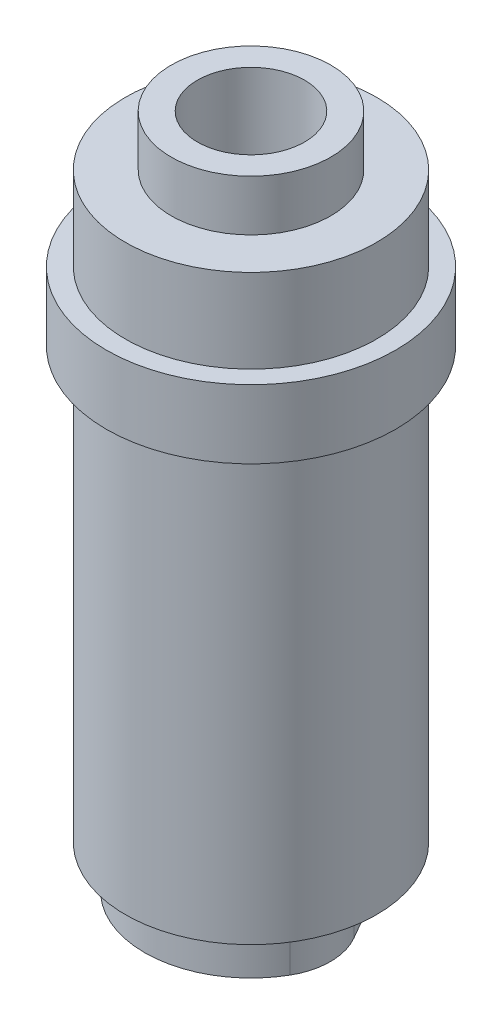
ISO-10303-21;
HEADER;
FILE_DESCRIPTION(('STEP AP214'),'2;1');
FILE_NAME('part.step','',(''),(''),'','','');
FILE_SCHEMA(('AUTOMOTIVE_DESIGN { 1 0 10303 214 1 1 1 1 }'));
ENDSEC;
DATA;
#1=APPLICATION_CONTEXT('core data for automotive mechanical design processes');
#2=APPLICATION_PROTOCOL_DEFINITION('international standard','automotive_design',2000,#1);
#3=PRODUCT_CONTEXT('',#1,'mechanical');
#4=PRODUCT('Part','Part','',(#3));
#5=PRODUCT_RELATED_PRODUCT_CATEGORY('part','',(#4));
#6=PRODUCT_DEFINITION_FORMATION('','',#4);
#7=PRODUCT_DEFINITION_CONTEXT('part definition',#1,'design');
#8=PRODUCT_DEFINITION('design','',#6,#7);
#9=PRODUCT_DEFINITION_SHAPE('','',#8);
#10=(LENGTH_UNIT() NAMED_UNIT(*) SI_UNIT(.MILLI.,.METRE.));
#11=(NAMED_UNIT(*) PLANE_ANGLE_UNIT() SI_UNIT($,.RADIAN.));
#12=(NAMED_UNIT(*) SI_UNIT($,.STERADIAN.) SOLID_ANGLE_UNIT());
#13=UNCERTAINTY_MEASURE_WITH_UNIT(LENGTH_MEASURE(1.E-05),#10,'distance_accuracy_value','');
#14=(GEOMETRIC_REPRESENTATION_CONTEXT(3) GLOBAL_UNCERTAINTY_ASSIGNED_CONTEXT((#13)) GLOBAL_UNIT_ASSIGNED_CONTEXT((#10,
#11,#12)) REPRESENTATION_CONTEXT('',''));
#15=CARTESIAN_POINT('',(0.,0.,0.));
#16=DIRECTION('',(0.,0.,1.));
#17=DIRECTION('',(1.,0.,0.));
#18=AXIS2_PLACEMENT_3D('',#15,#16,#17);
#19=CARTESIAN_POINT('',(0.,19.05,0.));
#20=DIRECTION('',(0.,-1.,0.));
#21=DIRECTION('',(0.,0.,-1.));
#22=AXIS2_PLACEMENT_3D('',#19,#20,#21);
#23=CYLINDRICAL_SURFACE('',#22,4.7625);
#24=CARTESIAN_POINT('',(0.,37.285900282,0.));
#25=DIRECTION('',(0.,-1.,0.));
#26=DIRECTION('',(0.,0.,-1.));
#27=AXIS2_PLACEMENT_3D('',#24,#25,#26);
#28=CIRCLE('',#27,4.7625);
#29=CARTESIAN_POINT('',(0.,37.285900282,-4.7625));
#30=VERTEX_POINT('',#29);
#31=EDGE_CURVE('E117',#30,#30,#28,.T.);
#32=ORIENTED_EDGE('',*,*,#31,.F.);
#33=EDGE_LOOP('',(#32));
#34=FACE_BOUND('',#33,.T.);
#35=CARTESIAN_POINT('',(0.,40.321700408,0.));
#36=DIRECTION('',(0.,-1.,0.));
#37=DIRECTION('',(0.,0.,-1.));
#38=AXIS2_PLACEMENT_3D('',#35,#36,#37);
#39=CIRCLE('',#38,4.7625);
#40=CARTESIAN_POINT('',(0.,40.321700408,-4.7625));
#41=VERTEX_POINT('',#40);
#42=EDGE_CURVE('E12',#41,#41,#39,.T.);
#43=ORIENTED_EDGE('',*,*,#42,.T.);
#44=EDGE_LOOP('',(#43));
#45=FACE_BOUND('',#44,.T.);
#46=ADVANCED_FACE('F20',(#34,#45),#23,.T.);
#47=CARTESIAN_POINT('',(-4.7625,40.321700408,0.));
#48=DIRECTION('',(0.,-1.,0.));
#49=DIRECTION('',(0.,0.,-1.));
#50=AXIS2_PLACEMENT_3D('',#47,#48,#49);
#51=PLANE('',#50);
#52=ORIENTED_EDGE('',*,*,#42,.F.);
#53=EDGE_LOOP('',(#52));
#54=FACE_BOUND('',#53,.T.);
#55=CARTESIAN_POINT('',(0.,40.321700408,0.));
#56=DIRECTION('',(0.,-1.,0.));
#57=DIRECTION('',(0.,0.,-1.));
#58=AXIS2_PLACEMENT_3D('',#55,#56,#57);
#59=CIRCLE('',#58,3.2004);
#60=CARTESIAN_POINT('',(0.,40.321700408,-3.2004));
#61=VERTEX_POINT('',#60);
#62=EDGE_CURVE('E31',#61,#61,#59,.T.);
#63=ORIENTED_EDGE('',*,*,#62,.T.);
#64=EDGE_LOOP('',(#63));
#65=FACE_BOUND('',#64,.T.);
#66=ADVANCED_FACE('F347',(#54,#65),#51,.F.);
#67=CARTESIAN_POINT('',(0.,19.05,0.));
#68=DIRECTION('',(0.,-1.,0.));
#69=DIRECTION('',(0.,0.,-1.));
#70=AXIS2_PLACEMENT_3D('',#67,#68,#69);
#71=CYLINDRICAL_SURFACE('',#70,3.2004);
#72=ORIENTED_EDGE('',*,*,#62,.F.);
#73=EDGE_LOOP('',(#72));
#74=FACE_BOUND('',#73,.T.);
#75=CARTESIAN_POINT('',(0.,27.621700408,0.));
#76=DIRECTION('',(0.,-1.,0.));
#77=DIRECTION('',(0.,0.,-1.));
#78=AXIS2_PLACEMENT_3D('',#75,#76,#77);
#79=CIRCLE('',#78,3.2004);
#80=CARTESIAN_POINT('',(0.,27.621700408,-3.2004));
#81=VERTEX_POINT('',#80);
#82=EDGE_CURVE('E263',#81,#81,#79,.T.);
#83=ORIENTED_EDGE('',*,*,#82,.T.);
#84=EDGE_LOOP('',(#83));
#85=FACE_BOUND('',#84,.T.);
#86=ADVANCED_FACE('F352',(#74,#85),#71,.F.);
#87=CARTESIAN_POINT('',(-3.2004,27.621700408,0.));
#88=DIRECTION('',(0.,-1.,0.));
#89=DIRECTION('',(0.,0.,-1.));
#90=AXIS2_PLACEMENT_3D('',#87,#88,#89);
#91=PLANE('',#90);
#92=CARTESIAN_POINT('',(0.,27.621700408,0.));
#93=DIRECTION('',(0.,-1.,0.));
#94=DIRECTION('',(0.,0.,-1.));
#95=AXIS2_PLACEMENT_3D('',#92,#93,#94);
#96=CIRCLE('',#95,2.5527);
#97=CARTESIAN_POINT('',(0.,27.621700408,-2.5527));
#98=VERTEX_POINT('',#97);
#99=EDGE_CURVE('E147',#98,#98,#96,.T.);
#100=ORIENTED_EDGE('',*,*,#99,.T.);
#101=EDGE_LOOP('',(#100));
#102=FACE_BOUND('',#101,.T.);
#103=ORIENTED_EDGE('',*,*,#82,.F.);
#104=EDGE_LOOP('',(#103));
#105=FACE_BOUND('',#104,.T.);
#106=ADVANCED_FACE('F330',(#102,#105),#91,.F.);
#107=CARTESIAN_POINT('',(-7.499999986,2.54,0.));
#108=DIRECTION('',(0.,1.,0.));
#109=DIRECTION('',(0.,0.,1.));
#110=AXIS2_PLACEMENT_3D('',#107,#108,#109);
#111=PLANE('',#110);
#112=CARTESIAN_POINT('',(0.,2.54,0.));
#113=DIRECTION('',(0.,-1.,0.));
#114=DIRECTION('',(0.,0.,-1.));
#115=AXIS2_PLACEMENT_3D('',#112,#113,#114);
#116=CIRCLE('',#115,7.499999986);
#117=CARTESIAN_POINT('',(0.,2.54,-7.499999986));
#118=VERTEX_POINT('',#117);
#119=EDGE_CURVE('E146',#118,#118,#116,.T.);
#120=ORIENTED_EDGE('',*,*,#119,.T.);
#121=EDGE_LOOP('',(#120));
#122=FACE_BOUND('',#121,.T.);
#123=DIRECTION('',(0.5,0.,-0.866025403784439));
#124=VECTOR('',#123,1.);
#125=CARTESIAN_POINT('',(-5.49926131403119,2.54,-0.635));
#126=LINE('',#125,#124);
#127=CARTESIAN_POINT('',(-5.49926131403119,2.54,-0.635));
#128=VERTEX_POINT('',#127);
#129=CARTESIAN_POINT('',(-3.29955678841871,2.54,-4.445));
#130=VERTEX_POINT('',#129);
#131=EDGE_CURVE('E104',#128,#130,#126,.T.);
#132=ORIENTED_EDGE('',*,*,#131,.F.);
#133=CARTESIAN_POINT('',(-2.19970452561247,2.54,1.27));
#134=DIRECTION('',(0.,1.,0.));
#135=DIRECTION('',(0.,0.,1.));
#136=AXIS2_PLACEMENT_3D('',#133,#134,#135);
#137=CIRCLE('',#136,3.81);
#138=CARTESIAN_POINT('',(-5.49926131403119,2.54,3.175));
#139=VERTEX_POINT('',#138);
#140=EDGE_CURVE('E114',#139,#128,#137,.F.);
#141=ORIENTED_EDGE('',*,*,#140,.F.);
#142=CARTESIAN_POINT('',(0.,2.54,0.));
#143=DIRECTION('',(0.,1.,0.));
#144=DIRECTION('',(0.,0.,1.));
#145=AXIS2_PLACEMENT_3D('',#142,#143,#144);
#146=CIRCLE('',#145,6.35);
#147=CARTESIAN_POINT('',(5.49926131403119,2.54,3.175));
#148=VERTEX_POINT('',#147);
#149=EDGE_CURVE('E118',#148,#139,#146,.F.);
#150=ORIENTED_EDGE('',*,*,#149,.F.);
#151=CARTESIAN_POINT('',(2.19970452561247,2.54,1.27));
#152=DIRECTION('',(0.,1.,0.));
#153=DIRECTION('',(0.,0.,1.));
#154=AXIS2_PLACEMENT_3D('',#151,#152,#153);
#155=CIRCLE('',#154,3.81);
#156=CARTESIAN_POINT('',(5.49926131403119,2.54,-0.635));
#157=VERTEX_POINT('',#156);
#158=EDGE_CURVE('E97',#157,#148,#155,.F.);
#159=ORIENTED_EDGE('',*,*,#158,.F.);
#160=DIRECTION('',(0.5,0.,0.866025403784439));
#161=VECTOR('',#160,1.);
#162=CARTESIAN_POINT('',(3.29955678841871,2.54,-4.445));
#163=LINE('',#162,#161);
#164=CARTESIAN_POINT('',(3.29955678841871,2.54,-4.445));
#165=VERTEX_POINT('',#164);
#166=EDGE_CURVE('E84',#165,#157,#163,.T.);
#167=ORIENTED_EDGE('',*,*,#166,.F.);
#168=CARTESIAN_POINT('',(0.,2.54,-2.54));
#169=DIRECTION('',(0.,1.,0.));
#170=DIRECTION('',(0.,0.,1.));
#171=AXIS2_PLACEMENT_3D('',#168,#169,#170);
#172=CIRCLE('',#171,3.81);
#173=EDGE_CURVE('E95',#130,#165,#172,.F.);
#174=ORIENTED_EDGE('',*,*,#173,.F.);
#175=EDGE_LOOP('',(#132,#141,#150,#159,#167,#174));
#176=FACE_BOUND('',#175,.T.);
#177=ADVANCED_FACE('F94',(#122,#176),#111,.F.);
#178=CARTESIAN_POINT('',(0.,19.05,0.));
#179=DIRECTION('',(0.,-1.,0.));
#180=DIRECTION('',(0.,0.,-1.));
#181=AXIS2_PLACEMENT_3D('',#178,#179,#180);
#182=CYLINDRICAL_SURFACE('',#181,7.499999986);
#183=ORIENTED_EDGE('',*,*,#119,.F.);
#184=EDGE_LOOP('',(#183));
#185=FACE_BOUND('',#184,.T.);
#186=CARTESIAN_POINT('',(0.,28.194,0.));
#187=DIRECTION('',(0.,-1.,0.));
#188=DIRECTION('',(0.,0.,-1.));
#189=AXIS2_PLACEMENT_3D('',#186,#187,#188);
#190=CIRCLE('',#189,7.499999986);
#191=CARTESIAN_POINT('',(0.,28.194,-7.499999986));
#192=VERTEX_POINT('',#191);
#193=EDGE_CURVE('E141',#192,#192,#190,.T.);
#194=ORIENTED_EDGE('',*,*,#193,.T.);
#195=EDGE_LOOP('',(#194));
#196=FACE_BOUND('',#195,.T.);
#197=ADVANCED_FACE('F364',(#185,#196),#182,.T.);
#198=CARTESIAN_POINT('',(-8.636,28.194,0.));
#199=DIRECTION('',(0.,1.,0.));
#200=DIRECTION('',(0.,0.,1.));
#201=AXIS2_PLACEMENT_3D('',#198,#199,#200);
#202=PLANE('',#201);
#203=ORIENTED_EDGE('',*,*,#193,.F.);
#204=EDGE_LOOP('',(#203));
#205=FACE_BOUND('',#204,.T.);
#206=CARTESIAN_POINT('',(0.,28.194,0.));
#207=DIRECTION('',(0.,-1.,0.));
#208=DIRECTION('',(0.,0.,-1.));
#209=AXIS2_PLACEMENT_3D('',#206,#207,#208);
#210=CIRCLE('',#209,8.636);
#211=CARTESIAN_POINT('',(0.,28.194,-8.636));
#212=VERTEX_POINT('',#211);
#213=EDGE_CURVE('E24',#212,#212,#210,.T.);
#214=ORIENTED_EDGE('',*,*,#213,.T.);
#215=EDGE_LOOP('',(#214));
#216=FACE_BOUND('',#215,.T.);
#217=ADVANCED_FACE('F22',(#205,#216),#202,.F.);
#218=CARTESIAN_POINT('',(0.,19.05,0.));
#219=DIRECTION('',(0.,-1.,0.));
#220=DIRECTION('',(0.,0.,-1.));
#221=AXIS2_PLACEMENT_3D('',#218,#219,#220);
#222=CYLINDRICAL_SURFACE('',#221,8.636);
#223=ORIENTED_EDGE('',*,*,#213,.F.);
#224=EDGE_LOOP('',(#223));
#225=FACE_BOUND('',#224,.T.);
#226=CARTESIAN_POINT('',(0.,32.285900376,0.));
#227=DIRECTION('',(0.,-1.,0.));
#228=DIRECTION('',(0.,0.,-1.));
#229=AXIS2_PLACEMENT_3D('',#226,#227,#228);
#230=CIRCLE('',#229,8.636);
#231=CARTESIAN_POINT('',(0.,32.285900376,-8.636));
#232=VERTEX_POINT('',#231);
#233=EDGE_CURVE('E184',#232,#232,#230,.T.);
#234=ORIENTED_EDGE('',*,*,#233,.T.);
#235=EDGE_LOOP('',(#234));
#236=FACE_BOUND('',#235,.T.);
#237=ADVANCED_FACE('F374',(#225,#236),#222,.T.);
#238=CARTESIAN_POINT('',(-8.636,32.285900376,0.));
#239=DIRECTION('',(0.,-1.,0.));
#240=DIRECTION('',(0.,0.,-1.));
#241=AXIS2_PLACEMENT_3D('',#238,#239,#240);
#242=PLANE('',#241);
#243=ORIENTED_EDGE('',*,*,#233,.F.);
#244=EDGE_LOOP('',(#243));
#245=FACE_BOUND('',#244,.T.);
#246=CARTESIAN_POINT('',(0.,32.285900376,0.));
#247=DIRECTION('',(0.,-1.,0.));
#248=DIRECTION('',(0.,0.,-1.));
#249=AXIS2_PLACEMENT_3D('',#246,#247,#248);
#250=CIRCLE('',#249,7.499999986);
#251=CARTESIAN_POINT('',(0.,32.285900376,-7.499999986));
#252=VERTEX_POINT('',#251);
#253=EDGE_CURVE('E190',#252,#252,#250,.T.);
#254=ORIENTED_EDGE('',*,*,#253,.T.);
#255=EDGE_LOOP('',(#254));
#256=FACE_BOUND('',#255,.T.);
#257=ADVANCED_FACE('F377',(#245,#256),#242,.F.);
#258=CARTESIAN_POINT('',(0.,19.05,0.));
#259=DIRECTION('',(0.,-1.,0.));
#260=DIRECTION('',(0.,0.,-1.));
#261=AXIS2_PLACEMENT_3D('',#258,#259,#260);
#262=CYLINDRICAL_SURFACE('',#261,7.499999986);
#263=ORIENTED_EDGE('',*,*,#253,.F.);
#264=EDGE_LOOP('',(#263));
#265=FACE_BOUND('',#264,.T.);
#266=CARTESIAN_POINT('',(0.,37.285900282,0.));
#267=DIRECTION('',(0.,-1.,0.));
#268=DIRECTION('',(0.,0.,-1.));
#269=AXIS2_PLACEMENT_3D('',#266,#267,#268);
#270=CIRCLE('',#269,7.499999986);
#271=CARTESIAN_POINT('',(0.,37.285900282,-7.499999986));
#272=VERTEX_POINT('',#271);
#273=EDGE_CURVE('E212',#272,#272,#270,.T.);
#274=ORIENTED_EDGE('',*,*,#273,.T.);
#275=EDGE_LOOP('',(#274));
#276=FACE_BOUND('',#275,.T.);
#277=ADVANCED_FACE('F381',(#265,#276),#262,.T.);
#278=CARTESIAN_POINT('',(-4.7625,37.285900282,0.));
#279=DIRECTION('',(0.,-1.,0.));
#280=DIRECTION('',(0.,0.,-1.));
#281=AXIS2_PLACEMENT_3D('',#278,#279,#280);
#282=PLANE('',#281);
#283=ORIENTED_EDGE('',*,*,#273,.F.);
#284=EDGE_LOOP('',(#283));
#285=FACE_BOUND('',#284,.T.);
#286=ORIENTED_EDGE('',*,*,#31,.T.);
#287=EDGE_LOOP('',(#286));
#288=FACE_BOUND('',#287,.T.);
#289=ADVANCED_FACE('F385',(#285,#288),#282,.F.);
#290=CARTESIAN_POINT('',(0.,23.6095192980614,-2.54));
#291=DIRECTION('',(0.,-1.,0.));
#292=DIRECTION('',(0.,0.,-1.));
#293=AXIS2_PLACEMENT_3D('',#290,#291,#292);
#294=CYLINDRICAL_SURFACE('',#293,3.81);
#295=ORIENTED_EDGE('',*,*,#173,.T.);
#296=DIRECTION('',(0.,-1.,0.));
#297=VECTOR('',#296,1.);
#298=CARTESIAN_POINT('',(3.29955678841871,23.6095192980614,-4.445));
#299=LINE('',#298,#297);
#300=CARTESIAN_POINT('',(3.29955678841871,0.,-4.445));
#301=VERTEX_POINT('',#300);
#302=EDGE_CURVE('E81',#165,#301,#299,.T.);
#303=ORIENTED_EDGE('',*,*,#302,.T.);
#304=CARTESIAN_POINT('',(0.,0.,-2.54));
#305=DIRECTION('',(0.,-1.,0.));
#306=DIRECTION('',(0.,0.,-1.));
#307=AXIS2_PLACEMENT_3D('',#304,#305,#306);
#308=CIRCLE('',#307,3.81);
#309=CARTESIAN_POINT('',(-3.29955678841871,0.,-4.445));
#310=VERTEX_POINT('',#309);
#311=EDGE_CURVE('E110',#310,#301,#308,.T.);
#312=ORIENTED_EDGE('',*,*,#311,.F.);
#313=DIRECTION('',(0.,-1.,0.));
#314=VECTOR('',#313,1.);
#315=CARTESIAN_POINT('',(-3.29955678841871,23.6095192980614,-4.445));
#316=LINE('',#315,#314);
#317=EDGE_CURVE('E101',#130,#310,#316,.T.);
#318=ORIENTED_EDGE('',*,*,#317,.F.);
#319=EDGE_LOOP('',(#295,#303,#312,#318));
#320=FACE_BOUND('',#319,.T.);
#321=ADVANCED_FACE('F100',(#320),#294,.T.);
#322=CARTESIAN_POINT('',(-5.49926131403119,23.6095192980614,-0.635));
#323=DIRECTION('',(-0.866025403784439,0.,-0.5));
#324=DIRECTION('',(-0.5,0.,0.866025403784439));
#325=AXIS2_PLACEMENT_3D('',#322,#323,#324);
#326=PLANE('',#325);
#327=ORIENTED_EDGE('',*,*,#131,.T.);
#328=ORIENTED_EDGE('',*,*,#317,.T.);
#329=DIRECTION('',(0.5,0.,-0.866025403784439));
#330=VECTOR('',#329,1.);
#331=CARTESIAN_POINT('',(-5.49926131403119,0.,-0.635));
#332=LINE('',#331,#330);
#333=CARTESIAN_POINT('',(-5.49926131403119,0.,-0.635));
#334=VERTEX_POINT('',#333);
#335=EDGE_CURVE('E161',#334,#310,#332,.T.);
#336=ORIENTED_EDGE('',*,*,#335,.F.);
#337=DIRECTION('',(0.,-1.,0.));
#338=VECTOR('',#337,1.);
#339=CARTESIAN_POINT('',(-5.49926131403119,23.6095192980614,-0.635));
#340=LINE('',#339,#338);
#341=EDGE_CURVE('E166',#128,#334,#340,.T.);
#342=ORIENTED_EDGE('',*,*,#341,.F.);
#343=EDGE_LOOP('',(#327,#328,#336,#342));
#344=FACE_BOUND('',#343,.T.);
#345=ADVANCED_FACE('F392',(#344),#326,.T.);
#346=CARTESIAN_POINT('',(-2.19970452561247,23.6095192980614,1.27));
#347=DIRECTION('',(0.,-1.,0.));
#348=DIRECTION('',(0.,0.,-1.));
#349=AXIS2_PLACEMENT_3D('',#346,#347,#348);
#350=CYLINDRICAL_SURFACE('',#349,3.81);
#351=ORIENTED_EDGE('',*,*,#140,.T.);
#352=ORIENTED_EDGE('',*,*,#341,.T.);
#353=CARTESIAN_POINT('',(-2.19970452561247,0.,1.27));
#354=DIRECTION('',(0.,-1.,0.));
#355=DIRECTION('',(0.,0.,-1.));
#356=AXIS2_PLACEMENT_3D('',#353,#354,#355);
#357=CIRCLE('',#356,3.81);
#358=CARTESIAN_POINT('',(-5.49926131403119,0.,3.175));
#359=VERTEX_POINT('',#358);
#360=EDGE_CURVE('E167',#359,#334,#357,.T.);
#361=ORIENTED_EDGE('',*,*,#360,.F.);
#362=DIRECTION('',(0.,-1.,0.));
#363=VECTOR('',#362,1.);
#364=CARTESIAN_POINT('',(-5.49926131403119,23.6095192980614,3.175));
#365=LINE('',#364,#363);
#366=EDGE_CURVE('E165',#139,#359,#365,.T.);
#367=ORIENTED_EDGE('',*,*,#366,.F.);
#368=EDGE_LOOP('',(#351,#352,#361,#367));
#369=FACE_BOUND('',#368,.T.);
#370=ADVANCED_FACE('F395',(#369),#350,.T.);
#371=CARTESIAN_POINT('',(0.,23.6095192980614,0.));
#372=DIRECTION('',(0.,-1.,0.));
#373=DIRECTION('',(0.,0.,-1.));
#374=AXIS2_PLACEMENT_3D('',#371,#372,#373);
#375=CYLINDRICAL_SURFACE('',#374,6.35);
#376=ORIENTED_EDGE('',*,*,#149,.T.);
#377=ORIENTED_EDGE('',*,*,#366,.T.);
#378=CARTESIAN_POINT('',(0.,0.,0.));
#379=DIRECTION('',(0.,-1.,0.));
#380=DIRECTION('',(0.,0.,-1.));
#381=AXIS2_PLACEMENT_3D('',#378,#379,#380);
#382=CIRCLE('',#381,6.35);
#383=CARTESIAN_POINT('',(5.49926131403119,0.,3.175));
#384=VERTEX_POINT('',#383);
#385=EDGE_CURVE('E410',#384,#359,#382,.T.);
#386=ORIENTED_EDGE('',*,*,#385,.F.);
#387=DIRECTION('',(0.,-1.,0.));
#388=VECTOR('',#387,1.);
#389=CARTESIAN_POINT('',(5.49926131403119,23.6095192980614,3.175));
#390=LINE('',#389,#388);
#391=EDGE_CURVE('E407',#148,#384,#390,.T.);
#392=ORIENTED_EDGE('',*,*,#391,.F.);
#393=EDGE_LOOP('',(#376,#377,#386,#392));
#394=FACE_BOUND('',#393,.T.);
#395=ADVANCED_FACE('F398',(#394),#375,.T.);
#396=CARTESIAN_POINT('',(2.19970452561247,23.6095192980614,1.27));
#397=DIRECTION('',(0.,-1.,0.));
#398=DIRECTION('',(0.,0.,-1.));
#399=AXIS2_PLACEMENT_3D('',#396,#397,#398);
#400=CYLINDRICAL_SURFACE('',#399,3.81);
#401=ORIENTED_EDGE('',*,*,#158,.T.);
#402=ORIENTED_EDGE('',*,*,#391,.T.);
#403=CARTESIAN_POINT('',(2.19970452561247,0.,1.27));
#404=DIRECTION('',(0.,-1.,0.));
#405=DIRECTION('',(0.,0.,-1.));
#406=AXIS2_PLACEMENT_3D('',#403,#404,#405);
#407=CIRCLE('',#406,3.81);
#408=CARTESIAN_POINT('',(5.49926131403119,0.,-0.635));
#409=VERTEX_POINT('',#408);
#410=EDGE_CURVE('E41',#409,#384,#407,.T.);
#411=ORIENTED_EDGE('',*,*,#410,.F.);
#412=DIRECTION('',(0.,-1.,0.));
#413=VECTOR('',#412,1.);
#414=CARTESIAN_POINT('',(5.49926131403119,23.6095192980614,-0.635));
#415=LINE('',#414,#413);
#416=EDGE_CURVE('E46',#157,#409,#415,.T.);
#417=ORIENTED_EDGE('',*,*,#416,.F.);
#418=EDGE_LOOP('',(#401,#402,#411,#417));
#419=FACE_BOUND('',#418,.T.);
#420=ADVANCED_FACE('F343',(#419),#400,.T.);
#421=CARTESIAN_POINT('',(3.29955678841871,23.6095192980614,-4.445));
#422=DIRECTION('',(0.866025403784439,0.,-0.5));
#423=DIRECTION('',(-0.5,0.,-0.866025403784439));
#424=AXIS2_PLACEMENT_3D('',#421,#422,#423);
#425=PLANE('',#424);
#426=ORIENTED_EDGE('',*,*,#166,.T.);
#427=ORIENTED_EDGE('',*,*,#416,.T.);
#428=DIRECTION('',(0.5,0.,0.866025403784439));
#429=VECTOR('',#428,1.);
#430=CARTESIAN_POINT('',(3.29955678841871,0.,-4.445));
#431=LINE('',#430,#429);
#432=EDGE_CURVE('E86',#301,#409,#431,.T.);
#433=ORIENTED_EDGE('',*,*,#432,.F.);
#434=ORIENTED_EDGE('',*,*,#302,.F.);
#435=EDGE_LOOP('',(#426,#427,#433,#434));
#436=FACE_BOUND('',#435,.T.);
#437=ADVANCED_FACE('F83',(#436),#425,.T.);
#438=CARTESIAN_POINT('',(0.,19.05,0.));
#439=DIRECTION('',(0.,-1.,0.));
#440=DIRECTION('',(0.,0.,-1.));
#441=AXIS2_PLACEMENT_3D('',#438,#439,#440);
#442=CYLINDRICAL_SURFACE('',#441,2.5527);
#443=CARTESIAN_POINT('',(0.,6.35,0.));
#444=DIRECTION('',(0.,-1.,0.));
#445=DIRECTION('',(0.,0.,-1.));
#446=AXIS2_PLACEMENT_3D('',#443,#444,#445);
#447=CIRCLE('',#446,2.5527);
#448=CARTESIAN_POINT('',(0.,6.35,-2.5527));
#449=VERTEX_POINT('',#448);
#450=EDGE_CURVE('E297',#449,#449,#447,.T.);
#451=ORIENTED_EDGE('',*,*,#450,.T.);
#452=EDGE_LOOP('',(#451));
#453=FACE_BOUND('',#452,.T.);
#454=ORIENTED_EDGE('',*,*,#99,.F.);
#455=EDGE_LOOP('',(#454));
#456=FACE_BOUND('',#455,.T.);
#457=ADVANCED_FACE('F333',(#453,#456),#442,.F.);
#458=CARTESIAN_POINT('',(-2.5527,6.35,0.));
#459=DIRECTION('',(0.,1.,0.));
#460=DIRECTION('',(0.,0.,1.));
#461=AXIS2_PLACEMENT_3D('',#458,#459,#460);
#462=PLANE('',#461);
#463=ORIENTED_EDGE('',*,*,#450,.F.);
#464=EDGE_LOOP('',(#463));
#465=FACE_BOUND('',#464,.T.);
#466=CARTESIAN_POINT('',(0.,6.35,0.));
#467=DIRECTION('',(0.,-1.,0.));
#468=DIRECTION('',(0.,0.,-1.));
#469=AXIS2_PLACEMENT_3D('',#466,#467,#468);
#470=CIRCLE('',#469,3.2639);
#471=CARTESIAN_POINT('',(0.,6.35,-3.2639));
#472=VERTEX_POINT('',#471);
#473=EDGE_CURVE('E246',#472,#472,#470,.T.);
#474=ORIENTED_EDGE('',*,*,#473,.T.);
#475=EDGE_LOOP('',(#474));
#476=FACE_BOUND('',#475,.T.);
#477=ADVANCED_FACE('F312',(#465,#476),#462,.F.);
#478=CARTESIAN_POINT('',(0.,19.05,0.));
#479=DIRECTION('',(0.,-1.,0.));
#480=DIRECTION('',(0.,0.,-1.));
#481=AXIS2_PLACEMENT_3D('',#478,#479,#480);
#482=CYLINDRICAL_SURFACE('',#481,3.2639);
#483=ORIENTED_EDGE('',*,*,#473,.F.);
#484=EDGE_LOOP('',(#483));
#485=FACE_BOUND('',#484,.T.);
#486=CARTESIAN_POINT('',(0.,0.,0.));
#487=DIRECTION('',(0.,-1.,0.));
#488=DIRECTION('',(0.,0.,-1.));
#489=AXIS2_PLACEMENT_3D('',#486,#487,#488);
#490=CIRCLE('',#489,3.2639);
#491=CARTESIAN_POINT('',(0.,0.,-3.2639));
#492=VERTEX_POINT('',#491);
#493=EDGE_CURVE('E241',#492,#492,#490,.T.);
#494=ORIENTED_EDGE('',*,*,#493,.T.);
#495=EDGE_LOOP('',(#494));
#496=FACE_BOUND('',#495,.T.);
#497=ADVANCED_FACE('F314',(#485,#496),#482,.F.);
#498=CARTESIAN_POINT('',(-7.449199986,0.,0.));
#499=DIRECTION('',(0.,1.,0.));
#500=DIRECTION('',(0.,0.,1.));
#501=AXIS2_PLACEMENT_3D('',#498,#499,#500);
#502=PLANE('',#501);
#503=ORIENTED_EDGE('',*,*,#493,.F.);
#504=EDGE_LOOP('',(#503));
#505=FACE_BOUND('',#504,.T.);
#506=ORIENTED_EDGE('',*,*,#311,.T.);
#507=ORIENTED_EDGE('',*,*,#432,.T.);
#508=ORIENTED_EDGE('',*,*,#410,.T.);
#509=ORIENTED_EDGE('',*,*,#385,.T.);
#510=ORIENTED_EDGE('',*,*,#360,.T.);
#511=ORIENTED_EDGE('',*,*,#335,.T.);
#512=EDGE_LOOP('',(#506,#507,#508,#509,#510,#511));
#513=FACE_BOUND('',#512,.T.);
#514=ADVANCED_FACE('F317',(#505,#513),#502,.F.);
#515=CLOSED_SHELL('',(#46,#66,#86,#106,#177,#197,#217,#237,#257,#277,#289,#321,#345,#370,#395,
#420,#437,#457,#477,#497,#514));
#516=MANIFOLD_SOLID_BREP('B1',#515);
#517=ADVANCED_BREP_SHAPE_REPRESENTATION('',(#18,#516),#14);
#518=SHAPE_DEFINITION_REPRESENTATION(#9,#517);
ENDSEC;
END-ISO-10303-21;
